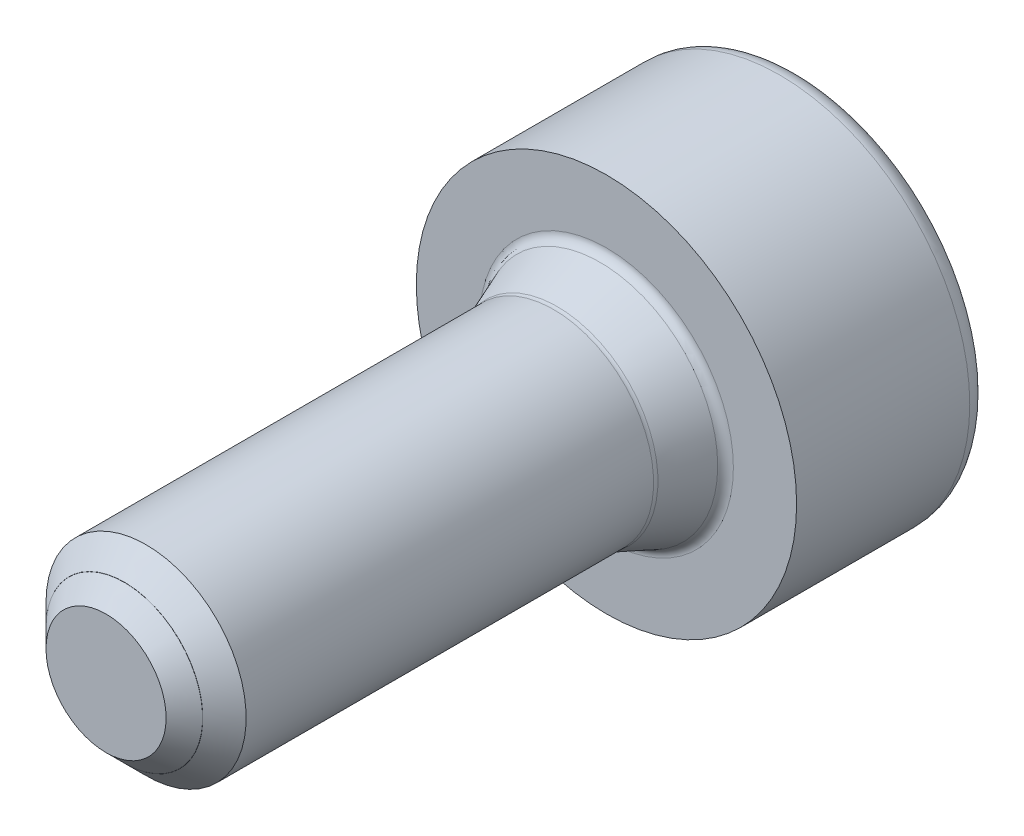
ISO-10303-21;
HEADER;
FILE_DESCRIPTION(('STEP AP214'),'2;1');
FILE_NAME('part.step','',(''),(''),'','','');
FILE_SCHEMA(('AUTOMOTIVE_DESIGN { 1 0 10303 214 1 1 1 1 }'));
ENDSEC;
DATA;
#1=APPLICATION_CONTEXT('core data for automotive mechanical design processes');
#2=APPLICATION_PROTOCOL_DEFINITION('international standard','automotive_design',2000,#1);
#3=PRODUCT_CONTEXT('',#1,'mechanical');
#4=PRODUCT('Part','Part','',(#3));
#5=PRODUCT_RELATED_PRODUCT_CATEGORY('part','',(#4));
#6=PRODUCT_DEFINITION_FORMATION('','',#4);
#7=PRODUCT_DEFINITION_CONTEXT('part definition',#1,'design');
#8=PRODUCT_DEFINITION('design','',#6,#7);
#9=PRODUCT_DEFINITION_SHAPE('','',#8);
#10=(LENGTH_UNIT() NAMED_UNIT(*) SI_UNIT(.MILLI.,.METRE.));
#11=(NAMED_UNIT(*) PLANE_ANGLE_UNIT() SI_UNIT($,.RADIAN.));
#12=(NAMED_UNIT(*) SI_UNIT($,.STERADIAN.) SOLID_ANGLE_UNIT());
#13=UNCERTAINTY_MEASURE_WITH_UNIT(LENGTH_MEASURE(1.E-05),#10,'distance_accuracy_value','');
#14=(GEOMETRIC_REPRESENTATION_CONTEXT(3) GLOBAL_UNCERTAINTY_ASSIGNED_CONTEXT((#13)) GLOBAL_UNIT_ASSIGNED_CONTEXT((#10,
#11,#12)) REPRESENTATION_CONTEXT('',''));
#15=CARTESIAN_POINT('',(0.,0.,0.));
#16=DIRECTION('',(0.,0.,1.));
#17=DIRECTION('',(1.,0.,0.));
#18=AXIS2_PLACEMENT_3D('',#15,#16,#17);
#19=CARTESIAN_POINT('',(11.,-1.35,10.82499251967));
#20=DIRECTION('',(0.,0.,-1.));
#21=DIRECTION('',(-1.,0.,0.));
#22=AXIS2_PLACEMENT_3D('',#19,#20,#21);
#23=CONICAL_SURFACE('',#22,0.4416729559301,1.04718484902488);
#24=CARTESIAN_POINT('',(11.0000000000003,-0.483974596215759,10.5799853326872));
#25=CARTESIAN_POINT('',(11.0329580428902,-0.503002931150194,10.5909748550174));
#26=CARTESIAN_POINT('',(11.0662005960396,-0.522195528159575,10.6009692526386));
#27=CARTESIAN_POINT('',(11.1332613102048,-0.560913049534868,10.6184141692237));
#28=CARTESIAN_POINT('',(11.1670806625274,-0.580438661702172,10.6258585170533));
#29=CARTESIAN_POINT('',(11.2343002358995,-0.619247900483343,10.6374461530633));
#30=CARTESIAN_POINT('',(11.2676901160255,-0.638525556762337,10.6416665775635));
#31=CARTESIAN_POINT('',(11.3346269115323,-0.677171533666861,10.6467039041215));
#32=CARTESIAN_POINT('',(11.3681735837526,-0.696539713903645,10.647524978911));
#33=CARTESIAN_POINT('',(11.4308517271364,-0.732726956858601,10.6458123276901));
#34=CARTESIAN_POINT('',(11.4599926051919,-0.749551450648388,10.6436991136606));
#35=CARTESIAN_POINT('',(11.518084506273,-0.783090825375306,10.6370028771495));
#36=CARTESIAN_POINT('',(11.5470353284991,-0.799805590380761,10.6324175693746));
#37=CARTESIAN_POINT('',(11.6052469089792,-0.833414062040914,10.6209552091911));
#38=CARTESIAN_POINT('',(11.6345003026894,-0.850303516774212,10.6140295891454));
#39=CARTESIAN_POINT('',(11.6925708787505,-0.883830579495086,10.5983113794108));
#40=CARTESIAN_POINT('',(11.7213888045643,-0.900468616721173,10.5895224807053));
#41=CARTESIAN_POINT('',(11.7500000000001,-0.916987298107893,10.5799853326871));
#42=B_SPLINE_CURVE_WITH_KNOTS('',3,(#24,#25,#26,#27,#28,#29,#30,#31,#32,#33,#34,#35,#36,#37,#38,
#39,#40,#41),.UNSPECIFIED.,.F.,.F.,(4,2,2,2,2,2,2,2,4),(0.,0.118881584152513,0.23804886286618,
0.354266945599876,0.470342327239836,0.571392045660927,0.672535338686801,0.775921626428418,
0.879104997727209),.UNSPECIFIED.);
#43=CARTESIAN_POINT('',(11.0000000000002,-0.48397459621564,10.5799853326871));
#44=VERTEX_POINT('',#43);
#45=CARTESIAN_POINT('',(11.7500000000001,-0.916987298108037,10.5799853326871));
#46=VERTEX_POINT('',#45);
#47=EDGE_CURVE('E31',#44,#46,#42,.T.);
#48=ORIENTED_EDGE('',*,*,#47,.T.);
#49=CARTESIAN_POINT('',(11.75,-0.916987298108182,10.5799853326872));
#50=CARTESIAN_POINT('',(11.75,-0.955043967977049,10.5909748550174));
#51=CARTESIAN_POINT('',(11.75,-0.993429161995811,10.6009692526386));
#52=CARTESIAN_POINT('',(11.75,-1.07086420474639,10.6184141692237));
#53=CARTESIAN_POINT('',(11.75,-1.109915429081,10.6258585170533));
#54=CARTESIAN_POINT('',(11.75,-1.18753390664334,10.6374461530633));
#55=CARTESIAN_POINT('',(11.75,-1.22608921920133,10.6416665775635));
#56=CARTESIAN_POINT('',(11.75,-1.30338117301037,10.6467039041215));
#57=CARTESIAN_POINT('',(11.75,-1.34211753348394,10.647524978911));
#58=CARTESIAN_POINT('',(11.75,-1.41449201939382,10.6458123276901));
#59=CARTESIAN_POINT('',(11.75,-1.44814100697337,10.6436991136606));
#60=CARTESIAN_POINT('',(11.75,-1.51521975642715,10.6370028771495));
#61=CARTESIAN_POINT('',(11.75,-1.54864928643803,10.6324175693746));
#62=CARTESIAN_POINT('',(11.75,-1.61586622975828,10.6209552091911));
#63=CARTESIAN_POINT('',(11.75,-1.64964513922485,10.6140295891454));
#64=CARTESIAN_POINT('',(11.75,-1.71669926466653,10.5983113794109));
#65=CARTESIAN_POINT('',(11.75,-1.74997533911868,10.5895224807053));
#66=CARTESIAN_POINT('',(11.75,-1.78301270189209,10.5799853326871));
#67=B_SPLINE_CURVE_WITH_KNOTS('',3,(#49,#50,#51,#52,#53,#54,#55,#56,#57,#58,#59,#60,#61,#62,#63,
#64,#65,#66),.UNSPECIFIED.,.F.,.F.,(4,2,2,2,2,2,2,2,4),(0.,0.118881584152513,0.238048862866177,
0.354266945599876,0.470342327239834,0.571392045660841,0.672535338686635,0.775921626428166,
0.879104997726869),.UNSPECIFIED.);
#68=CARTESIAN_POINT('',(11.75,-1.78301270189205,10.5799853326871));
#69=VERTEX_POINT('',#68);
#70=EDGE_CURVE('E10',#46,#69,#67,.T.);
#71=ORIENTED_EDGE('',*,*,#70,.T.);
#72=CARTESIAN_POINT('',(11.7499999999996,-1.78301270189211,10.5799853326873));
#73=CARTESIAN_POINT('',(11.7170419571097,-1.80204103682654,10.5909748550175));
#74=CARTESIAN_POINT('',(11.6837994039603,-1.82123363383592,10.6009692526387));
#75=CARTESIAN_POINT('',(11.6167386897952,-1.8599511552112,10.6184141692238));
#76=CARTESIAN_POINT('',(11.5829193374725,-1.8794767673785,10.6258585170534));
#77=CARTESIAN_POINT('',(11.5156997641005,-1.91828600615966,10.6374461530634));
#78=CARTESIAN_POINT('',(11.4823098839744,-1.93756366243865,10.6416665775636));
#79=CARTESIAN_POINT('',(11.4153730884677,-1.97620963934317,10.6467039041216));
#80=CARTESIAN_POINT('',(11.3818264162474,-1.99557781957995,10.6475249789111));
#81=CARTESIAN_POINT('',(11.3191482728636,-2.03176506253489,10.6458123276903));
#82=CARTESIAN_POINT('',(11.2900073948081,-2.04858955632468,10.6436991136608));
#83=CARTESIAN_POINT('',(11.231915493727,-2.08212893105159,10.6370028771496));
#84=CARTESIAN_POINT('',(11.202964671501,-2.09884369605705,10.6324175693748));
#85=CARTESIAN_POINT('',(11.1447530910209,-2.1324521677172,10.6209552091912));
#86=CARTESIAN_POINT('',(11.1154996973106,-2.14934162245049,10.6140295891456));
#87=CARTESIAN_POINT('',(11.0574291212496,-2.18286868517136,10.598311379411));
#88=CARTESIAN_POINT('',(11.0286111954358,-2.19950672239745,10.5895224807054));
#89=CARTESIAN_POINT('',(10.9999999999999,-2.21602540378417,10.5799853326873));
#90=B_SPLINE_CURVE_WITH_KNOTS('',3,(#72,#73,#74,#75,#76,#77,#78,#79,#80,#81,#82,#83,#84,#85,#86,
#87,#88,#89),.UNSPECIFIED.,.F.,.F.,(4,2,2,2,2,2,2,2,4),(0.,0.118881584152485,0.238048862866124,
0.354266945599796,0.470342327239724,0.571392045660802,0.672535338686665,0.77592162642827,
0.879104997727046),.UNSPECIFIED.);
#91=CARTESIAN_POINT('',(10.9999999999998,-2.21602540378405,10.5799853326873));
#92=VERTEX_POINT('',#91);
#93=EDGE_CURVE('E19',#69,#92,#90,.T.);
#94=ORIENTED_EDGE('',*,*,#93,.T.);
#95=CARTESIAN_POINT('',(10.9999999999997,-2.21602540378393,10.5799853326874));
#96=CARTESIAN_POINT('',(10.9670419571098,-2.1969970688495,10.5909748550176));
#97=CARTESIAN_POINT('',(10.9337994039604,-2.17780447184012,10.6009692526388));
#98=CARTESIAN_POINT('',(10.8667386897953,-2.13908695046485,10.6184141692239));
#99=CARTESIAN_POINT('',(10.8329193374726,-2.11956133829755,10.6258585170534));
#100=CARTESIAN_POINT('',(10.7656997641006,-2.08075209951639,10.6374461530635));
#101=CARTESIAN_POINT('',(10.7323098839745,-2.0614744432374,10.6416665775637));
#102=CARTESIAN_POINT('',(10.6653730884678,-2.02282846633289,10.6467039041217));
#103=CARTESIAN_POINT('',(10.6318264162475,-2.00346028609612,10.6475249789111));
#104=CARTESIAN_POINT('',(10.5691482728637,-1.96727304314116,10.6458123276903));
#105=CARTESIAN_POINT('',(10.5400073948082,-1.95044854935137,10.6436991136608));
#106=CARTESIAN_POINT('',(10.4819154937271,-1.91690917462445,10.6370028771496));
#107=CARTESIAN_POINT('',(10.452964671501,-1.90019440961899,10.6324175693747));
#108=CARTESIAN_POINT('',(10.3947530910209,-1.86658593795883,10.6209552091912));
#109=CARTESIAN_POINT('',(10.3654996973107,-1.84969648322553,10.6140295891455));
#110=CARTESIAN_POINT('',(10.3074291212496,-1.81616942050465,10.5983113794109));
#111=CARTESIAN_POINT('',(10.2786111954358,-1.79953138327856,10.5895224807054));
#112=CARTESIAN_POINT('',(10.2499999999999,-1.78301270189183,10.5799853326872));
#113=B_SPLINE_CURVE_WITH_KNOTS('',3,(#95,#96,#97,#98,#99,#100,#101,#102,#103,#104,#105,#106,
#107,#108,#109,#110,#111,#112),.UNSPECIFIED.,.F.,.F.,(4,2,2,2,2,2,2,2,4),(0.,0.11888158415247,
0.238048862866095,0.354266945599751,0.470342327239666,0.571392045660778,0.672535338686677,
0.775921626428318,0.87910499772713),.UNSPECIFIED.);
#114=CARTESIAN_POINT('',(10.25,-1.78301270189172,10.5799853326872));
#115=VERTEX_POINT('',#114);
#116=EDGE_CURVE('E72',#92,#115,#113,.T.);
#117=ORIENTED_EDGE('',*,*,#116,.T.);
#118=CARTESIAN_POINT('',(10.25,-1.78301270189161,10.5799853326873));
#119=CARTESIAN_POINT('',(10.25,-1.74495603202275,10.5909748550174));
#120=CARTESIAN_POINT('',(10.25,-1.70657083800399,10.6009692526387));
#121=CARTESIAN_POINT('',(10.25,-1.62913579525342,10.6184141692237));
#122=CARTESIAN_POINT('',(10.25,-1.59008457091881,10.6258585170533));
#123=CARTESIAN_POINT('',(10.25,-1.51246609335648,10.6374461530633));
#124=CARTESIAN_POINT('',(10.25,-1.4739107807985,10.6416665775635));
#125=CARTESIAN_POINT('',(10.25,-1.39661882698946,10.6467039041215));
#126=CARTESIAN_POINT('',(10.25,-1.3578824665159,10.647524978911));
#127=CARTESIAN_POINT('',(10.25,-1.28550798060601,10.6458123276901));
#128=CARTESIAN_POINT('',(10.25,-1.25185899302646,10.6436991136606));
#129=CARTESIAN_POINT('',(10.25,-1.18478024357266,10.6370028771494));
#130=CARTESIAN_POINT('',(10.25,-1.15135071356177,10.6324175693746));
#131=CARTESIAN_POINT('',(10.25,-1.08413377024151,10.620955209191));
#132=CARTESIAN_POINT('',(10.25,-1.05035486077493,10.6140295891454));
#133=CARTESIAN_POINT('',(10.25,-0.983300735333227,10.5983113794108));
#134=CARTESIAN_POINT('',(10.25,-0.950024660881073,10.5895224807052));
#135=CARTESIAN_POINT('',(10.25,-0.916987298107654,10.5799853326871));
#136=B_SPLINE_CURVE_WITH_KNOTS('',3,(#118,#119,#120,#121,#122,#123,#124,#125,#126,#127,#128,
#129,#130,#131,#132,#133,#134,#135),.UNSPECIFIED.,.F.,.F.,(4,2,2,2,2,2,2,2,4),(0.,
0.118881584152499,0.238048862866149,0.354266945599835,0.470342327239778,0.571392045660812,
0.672535338686631,0.775921626428189,0.879104997726918),.UNSPECIFIED.);
#137=CARTESIAN_POINT('',(10.2500000000002,-0.916987298107647,10.5799853326871));
#138=VERTEX_POINT('',#137);
#139=EDGE_CURVE('E154',#115,#138,#136,.T.);
#140=ORIENTED_EDGE('',*,*,#139,.T.);
#141=CARTESIAN_POINT('',(10.2500000000003,-0.916987298107641,10.5799853326872));
#142=CARTESIAN_POINT('',(10.2829580428902,-0.897958963173206,10.5909748550174));
#143=CARTESIAN_POINT('',(10.3162005960396,-0.878766366163824,10.6009692526386));
#144=CARTESIAN_POINT('',(10.3832613102048,-0.840048844788532,10.6184141692237));
#145=CARTESIAN_POINT('',(10.4170806625274,-0.820523232621228,10.6258585170533));
#146=CARTESIAN_POINT('',(10.4843002358995,-0.781713993840057,10.6374461530633));
#147=CARTESIAN_POINT('',(10.5176901160255,-0.762436337561063,10.6416665775635));
#148=CARTESIAN_POINT('',(10.5846269115323,-0.72379036065654,10.6467039041215));
#149=CARTESIAN_POINT('',(10.6181735837526,-0.704422180419756,10.647524978911));
#150=CARTESIAN_POINT('',(10.6808517271364,-0.668234937464802,10.6458123276901));
#151=CARTESIAN_POINT('',(10.7099926051919,-0.651410443675015,10.6436991136606));
#152=CARTESIAN_POINT('',(10.768084506273,-0.617871068948099,10.6370028771495));
#153=CARTESIAN_POINT('',(10.797035328499,-0.601156303942644,10.6324175693746));
#154=CARTESIAN_POINT('',(10.8552469089792,-0.567547832282494,10.6209552091911));
#155=CARTESIAN_POINT('',(10.8845003026894,-0.550658377549196,10.6140295891454));
#156=CARTESIAN_POINT('',(10.9425708787505,-0.517131314828325,10.5983113794108));
#157=CARTESIAN_POINT('',(10.9713888045643,-0.500493277602238,10.5895224807053));
#158=CARTESIAN_POINT('',(11.0000000000001,-0.48397459621552,10.5799853326871));
#159=B_SPLINE_CURVE_WITH_KNOTS('',3,(#141,#142,#143,#144,#145,#146,#147,#148,#149,#150,#151,
#152,#153,#154,#155,#156,#157,#158),.UNSPECIFIED.,.F.,.F.,(4,2,2,2,2,2,2,2,4),(0.,
0.118881584152513,0.238048862866178,0.354266945599874,0.470342327239834,0.571392045660917,
0.672535338686789,0.775921626428399,0.879104997727181),.UNSPECIFIED.);
#160=EDGE_CURVE('E126',#138,#44,#159,.T.);
#161=ORIENTED_EDGE('',*,*,#160,.T.);
#162=EDGE_LOOP('',(#48,#71,#94,#117,#140,#161));
#163=FACE_BOUND('',#162,.T.);
#164=CARTESIAN_POINT('',(11.,-1.35,11.08));
#165=VERTEX_POINT('',#164);
#166=VERTEX_LOOP('',#165);
#167=FACE_BOUND('',#166,.T.);
#168=ADVANCED_FACE('F15',(#163,#167),#23,.F.);
#169=CARTESIAN_POINT('',(11.75,-1.35,10.33));
#170=DIRECTION('',(1.,0.,0.));
#171=DIRECTION('',(0.,1.,0.));
#172=AXIS2_PLACEMENT_3D('',#169,#170,#171);
#173=PLANE('',#172);
#174=DIRECTION('',(0.,-1.,0.));
#175=VECTOR('',#174,1.);
#176=CARTESIAN_POINT('',(11.75,-0.9169872981078,9.58));
#177=LINE('',#176,#175);
#178=CARTESIAN_POINT('',(11.75,-0.9169872981078,9.58));
#179=VERTEX_POINT('',#178);
#180=CARTESIAN_POINT('',(11.75,-1.783012701892,9.58));
#181=VERTEX_POINT('',#180);
#182=EDGE_CURVE('E329',#179,#181,#177,.T.);
#183=ORIENTED_EDGE('',*,*,#182,.T.);
#184=DIRECTION('',(0.,0.,-1.));
#185=VECTOR('',#184,1.);
#186=CARTESIAN_POINT('',(11.75,-1.783012701892,10.57998533269));
#187=LINE('',#186,#185);
#188=EDGE_CURVE('E149',#69,#181,#187,.T.);
#189=ORIENTED_EDGE('',*,*,#188,.F.);
#190=ORIENTED_EDGE('',*,*,#70,.F.);
#191=DIRECTION('',(0.,0.,-1.));
#192=VECTOR('',#191,1.);
#193=CARTESIAN_POINT('',(11.75,-0.9169872981078,10.57998533269));
#194=LINE('',#193,#192);
#195=EDGE_CURVE('E130',#46,#179,#194,.T.);
#196=ORIENTED_EDGE('',*,*,#195,.T.);
#197=EDGE_LOOP('',(#183,#189,#190,#196));
#198=FACE_BOUND('',#197,.T.);
#199=ADVANCED_FACE('F117',(#198),#173,.F.);
#200=CARTESIAN_POINT('',(11.375,-0.7004809471617,10.33));
#201=DIRECTION('',(0.500000000000017,0.866025403784429,0.));
#202=DIRECTION('',(0.,0.,-1.));
#203=AXIS2_PLACEMENT_3D('',#200,#201,#202);
#204=PLANE('',#203);
#205=DIRECTION('',(-0.866025403784429,0.500000000000017,0.));
#206=VECTOR('',#205,1.);
#207=CARTESIAN_POINT('',(11.75,-0.9169872981078,9.58));
#208=LINE('',#207,#206);
#209=CARTESIAN_POINT('',(11.,-0.4839745962156,9.58));
#210=VERTEX_POINT('',#209);
#211=EDGE_CURVE('E134',#179,#210,#208,.T.);
#212=ORIENTED_EDGE('',*,*,#211,.F.);
#213=ORIENTED_EDGE('',*,*,#195,.F.);
#214=ORIENTED_EDGE('',*,*,#47,.F.);
#215=DIRECTION('',(0.,0.,-1.));
#216=VECTOR('',#215,1.);
#217=CARTESIAN_POINT('',(11.,-0.4839745962156,10.57998533269));
#218=LINE('',#217,#216);
#219=EDGE_CURVE('E143',#44,#210,#218,.T.);
#220=ORIENTED_EDGE('',*,*,#219,.T.);
#221=EDGE_LOOP('',(#212,#213,#214,#220));
#222=FACE_BOUND('',#221,.T.);
#223=ADVANCED_FACE('F122',(#222),#204,.F.);
#224=CARTESIAN_POINT('',(10.625,-0.7004809471617,10.33));
#225=DIRECTION('',(-0.500000000000017,0.866025403784429,0.));
#226=DIRECTION('',(0.,0.,1.));
#227=AXIS2_PLACEMENT_3D('',#224,#225,#226);
#228=PLANE('',#227);
#229=DIRECTION('',(-0.866025403784429,-0.500000000000017,0.));
#230=VECTOR('',#229,1.);
#231=CARTESIAN_POINT('',(11.,-0.4839745962156,9.58));
#232=LINE('',#231,#230);
#233=CARTESIAN_POINT('',(10.25,-0.9169872981078,9.58));
#234=VERTEX_POINT('',#233);
#235=EDGE_CURVE('E290',#210,#234,#232,.T.);
#236=ORIENTED_EDGE('',*,*,#235,.F.);
#237=ORIENTED_EDGE('',*,*,#219,.F.);
#238=ORIENTED_EDGE('',*,*,#160,.F.);
#239=DIRECTION('',(0.,0.,-1.));
#240=VECTOR('',#239,1.);
#241=CARTESIAN_POINT('',(10.25,-0.9169872981078,10.57998533269));
#242=LINE('',#241,#240);
#243=EDGE_CURVE('E155',#138,#234,#242,.T.);
#244=ORIENTED_EDGE('',*,*,#243,.T.);
#245=EDGE_LOOP('',(#236,#237,#238,#244));
#246=FACE_BOUND('',#245,.T.);
#247=ADVANCED_FACE('F239',(#246),#228,.F.);
#248=CARTESIAN_POINT('',(10.25,-1.35,10.33));
#249=DIRECTION('',(-1.,0.,0.));
#250=DIRECTION('',(0.,0.,1.));
#251=AXIS2_PLACEMENT_3D('',#248,#249,#250);
#252=PLANE('',#251);
#253=DIRECTION('',(0.,1.,0.));
#254=VECTOR('',#253,1.);
#255=CARTESIAN_POINT('',(10.25,-1.783012701892,9.58));
#256=LINE('',#255,#254);
#257=CARTESIAN_POINT('',(10.25,-1.783012701892,9.58));
#258=VERTEX_POINT('',#257);
#259=EDGE_CURVE('E287',#258,#234,#256,.T.);
#260=ORIENTED_EDGE('',*,*,#259,.T.);
#261=ORIENTED_EDGE('',*,*,#243,.F.);
#262=ORIENTED_EDGE('',*,*,#139,.F.);
#263=DIRECTION('',(0.,0.,-1.));
#264=VECTOR('',#263,1.);
#265=CARTESIAN_POINT('',(10.25,-1.783012701892,10.57998533269));
#266=LINE('',#265,#264);
#267=EDGE_CURVE('E80',#115,#258,#266,.T.);
#268=ORIENTED_EDGE('',*,*,#267,.T.);
#269=EDGE_LOOP('',(#260,#261,#262,#268));
#270=FACE_BOUND('',#269,.T.);
#271=ADVANCED_FACE('F258',(#270),#252,.F.);
#272=CARTESIAN_POINT('',(10.625,-1.999519052838,10.33));
#273=DIRECTION('',(-0.500000000000017,-0.866025403784429,0.));
#274=DIRECTION('',(-0.866025403784429,0.500000000000017,0.));
#275=AXIS2_PLACEMENT_3D('',#272,#273,#274);
#276=PLANE('',#275);
#277=DIRECTION('',(0.866025403784429,-0.500000000000017,0.));
#278=VECTOR('',#277,1.);
#279=CARTESIAN_POINT('',(10.25,-1.783012701892,9.58));
#280=LINE('',#279,#278);
#281=CARTESIAN_POINT('',(11.,-2.216025403784,9.58));
#282=VERTEX_POINT('',#281);
#283=EDGE_CURVE('E147',#258,#282,#280,.T.);
#284=ORIENTED_EDGE('',*,*,#283,.F.);
#285=ORIENTED_EDGE('',*,*,#267,.F.);
#286=ORIENTED_EDGE('',*,*,#116,.F.);
#287=DIRECTION('',(0.,0.,-1.));
#288=VECTOR('',#287,1.);
#289=CARTESIAN_POINT('',(11.,-2.216025403784,10.57998533269));
#290=LINE('',#289,#288);
#291=EDGE_CURVE('E160',#92,#282,#290,.T.);
#292=ORIENTED_EDGE('',*,*,#291,.T.);
#293=EDGE_LOOP('',(#284,#285,#286,#292));
#294=FACE_BOUND('',#293,.T.);
#295=ADVANCED_FACE('F264',(#294),#276,.F.);
#296=CARTESIAN_POINT('',(11.375,-1.999519052838,10.33));
#297=DIRECTION('',(0.500000000000017,-0.866025403784429,0.));
#298=DIRECTION('',(0.,0.,-1.));
#299=AXIS2_PLACEMENT_3D('',#296,#297,#298);
#300=PLANE('',#299);
#301=DIRECTION('',(0.866025403784429,0.500000000000017,0.));
#302=VECTOR('',#301,1.);
#303=CARTESIAN_POINT('',(11.,-2.216025403784,9.58));
#304=LINE('',#303,#302);
#305=EDGE_CURVE('E325',#282,#181,#304,.T.);
#306=ORIENTED_EDGE('',*,*,#305,.F.);
#307=ORIENTED_EDGE('',*,*,#291,.F.);
#308=ORIENTED_EDGE('',*,*,#93,.F.);
#309=ORIENTED_EDGE('',*,*,#188,.T.);
#310=EDGE_LOOP('',(#306,#307,#308,#309));
#311=FACE_BOUND('',#310,.T.);
#312=ADVANCED_FACE('F268',(#311),#300,.F.);
#313=CARTESIAN_POINT('',(11.,-1.35,9.58));
#314=DIRECTION('',(0.,0.,-1.));
#315=DIRECTION('',(0.,-1.,0.));
#316=AXIS2_PLACEMENT_3D('',#313,#314,#315);
#317=PLANE('',#316);
#318=CARTESIAN_POINT('',(11.,-1.35,9.58));
#319=DIRECTION('',(0.,0.,-1.));
#320=DIRECTION('',(1.,0.,0.));
#321=AXIS2_PLACEMENT_3D('',#318,#319,#320);
#322=CIRCLE('',#321,1.7);
#323=CARTESIAN_POINT('',(12.7,-1.35,9.58));
#324=VERTEX_POINT('',#323);
#325=EDGE_CURVE('E321',#324,#324,#322,.T.);
#326=ORIENTED_EDGE('',*,*,#325,.T.);
#327=EDGE_LOOP('',(#326));
#328=FACE_BOUND('',#327,.T.);
#329=ORIENTED_EDGE('',*,*,#305,.T.);
#330=ORIENTED_EDGE('',*,*,#182,.F.);
#331=ORIENTED_EDGE('',*,*,#211,.T.);
#332=ORIENTED_EDGE('',*,*,#235,.T.);
#333=ORIENTED_EDGE('',*,*,#259,.F.);
#334=ORIENTED_EDGE('',*,*,#283,.T.);
#335=EDGE_LOOP('',(#329,#330,#331,#332,#333,#334));
#336=FACE_BOUND('',#335,.T.);
#337=ADVANCED_FACE('F269',(#328,#336),#317,.T.);
#338=CARTESIAN_POINT('',(11.,-1.35,9.78));
#339=DIRECTION('',(0.,0.,-1.));
#340=DIRECTION('',(-1.,0.,0.));
#341=AXIS2_PLACEMENT_3D('',#338,#339,#340);
#342=TOROIDAL_SURFACE('',#341,1.7,0.2);
#343=ORIENTED_EDGE('',*,*,#325,.F.);
#344=EDGE_LOOP('',(#343));
#345=FACE_BOUND('',#344,.T.);
#346=CARTESIAN_POINT('',(11.,-1.35,9.78));
#347=DIRECTION('',(0.,0.,-1.));
#348=DIRECTION('',(-1.,0.,0.));
#349=AXIS2_PLACEMENT_3D('',#346,#347,#348);
#350=CIRCLE('',#349,1.9);
#351=CARTESIAN_POINT('',(9.1,-1.35,9.78));
#352=VERTEX_POINT('',#351);
#353=EDGE_CURVE('E326',#352,#352,#350,.T.);
#354=ORIENTED_EDGE('',*,*,#353,.T.);
#355=EDGE_LOOP('',(#354));
#356=FACE_BOUND('',#355,.T.);
#357=ADVANCED_FACE('F181',(#345,#356),#342,.T.);
#358=CARTESIAN_POINT('',(11.,-1.35,9.58));
#359=DIRECTION('',(0.,0.,1.));
#360=DIRECTION('',(1.,0.,0.));
#361=AXIS2_PLACEMENT_3D('',#358,#359,#360);
#362=CYLINDRICAL_SURFACE('',#361,1.9);
#363=CARTESIAN_POINT('',(11.,-1.35,11.51));
#364=DIRECTION('',(0.,0.,1.));
#365=DIRECTION('',(1.,0.,0.));
#366=AXIS2_PLACEMENT_3D('',#363,#364,#365);
#367=CIRCLE('',#366,1.9);
#368=CARTESIAN_POINT('',(12.9,-1.35,11.51));
#369=VERTEX_POINT('',#368);
#370=EDGE_CURVE('E298',#369,#369,#367,.T.);
#371=ORIENTED_EDGE('',*,*,#370,.F.);
#372=EDGE_LOOP('',(#371));
#373=FACE_BOUND('',#372,.T.);
#374=ORIENTED_EDGE('',*,*,#353,.F.);
#375=EDGE_LOOP('',(#374));
#376=FACE_BOUND('',#375,.T.);
#377=ADVANCED_FACE('F396',(#373,#376),#362,.T.);
#378=CARTESIAN_POINT('',(11.,-1.35,11.51));
#379=DIRECTION('',(0.,0.,1.));
#380=DIRECTION('',(1.,0.,0.));
#381=AXIS2_PLACEMENT_3D('',#378,#379,#380);
#382=PLANE('',#381);
#383=ORIENTED_EDGE('',*,*,#370,.T.);
#384=EDGE_LOOP('',(#383));
#385=FACE_BOUND('',#384,.T.);
#386=CARTESIAN_POINT('',(11.,-1.35,11.51));
#387=DIRECTION('',(0.,0.,-1.));
#388=DIRECTION('',(-1.,0.,0.));
#389=AXIS2_PLACEMENT_3D('',#386,#387,#388);
#390=CIRCLE('',#389,1.268198791567);
#391=CARTESIAN_POINT('',(9.731801208433,-1.35,11.51));
#392=VERTEX_POINT('',#391);
#393=EDGE_CURVE('E300',#392,#392,#390,.T.);
#394=ORIENTED_EDGE('',*,*,#393,.T.);
#395=EDGE_LOOP('',(#394));
#396=FACE_BOUND('',#395,.T.);
#397=ADVANCED_FACE('F465',(#385,#396),#382,.T.);
#398=CARTESIAN_POINT('',(11.,-1.35,11.61));
#399=DIRECTION('',(0.,0.,1.));
#400=DIRECTION('',(1.,0.,0.));
#401=AXIS2_PLACEMENT_3D('',#398,#399,#400);
#402=TOROIDAL_SURFACE('',#401,1.268198791567,0.1);
#403=ORIENTED_EDGE('',*,*,#393,.F.);
#404=EDGE_LOOP('',(#403));
#405=FACE_BOUND('',#404,.T.);
#406=CARTESIAN_POINT('',(11.,-1.35,11.57349124712));
#407=DIRECTION('',(0.,0.,-1.));
#408=DIRECTION('',(1.,0.,0.));
#409=AXIS2_PLACEMENT_3D('',#406,#407,#408);
#410=CIRCLE('',#409,1.175101471718);
#411=CARTESIAN_POINT('',(12.175101471718,-1.35,11.57349124712));
#412=VERTEX_POINT('',#411);
#413=EDGE_CURVE('E304',#412,#412,#410,.T.);
#414=ORIENTED_EDGE('',*,*,#413,.T.);
#415=EDGE_LOOP('',(#414));
#416=FACE_BOUND('',#415,.T.);
#417=ADVANCED_FACE('F230',(#405,#416),#402,.F.);
#418=CARTESIAN_POINT('',(11.,-1.35,11.78794470637));
#419=DIRECTION('',(0.,0.,-1.));
#420=DIRECTION('',(-1.,0.,0.));
#421=AXIS2_PLACEMENT_3D('',#418,#419,#420);
#422=CONICAL_SURFACE('',#421,1.091002075935,0.373726819965523);
#423=ORIENTED_EDGE('',*,*,#413,.F.);
#424=EDGE_LOOP('',(#423));
#425=FACE_BOUND('',#424,.T.);
#426=CARTESIAN_POINT('',(11.,-1.35,12.00239816561));
#427=DIRECTION('',(0.,0.,1.));
#428=DIRECTION('',(-1.,0.,0.));
#429=AXIS2_PLACEMENT_3D('',#426,#427,#428);
#430=CIRCLE('',#429,1.006902680151);
#431=CARTESIAN_POINT('',(9.993097319849,-1.35,12.00239816561));
#432=VERTEX_POINT('',#431);
#433=EDGE_CURVE('E314',#432,#432,#430,.T.);
#434=ORIENTED_EDGE('',*,*,#433,.F.);
#435=EDGE_LOOP('',(#434));
#436=FACE_BOUND('',#435,.T.);
#437=ADVANCED_FACE('F226',(#425,#436),#422,.T.);
#438=CARTESIAN_POINT('',(11.,-1.35,12.0389069185));
#439=DIRECTION('',(0.,0.,-1.));
#440=DIRECTION('',(-1.,0.,0.));
#441=AXIS2_PLACEMENT_3D('',#438,#439,#440);
#442=TOROIDAL_SURFACE('',#441,1.1,0.1);
#443=CARTESIAN_POINT('',(11.,-1.35,12.0389069185));
#444=DIRECTION('',(0.,0.,-1.));
#445=DIRECTION('',(-1.,0.,0.));
#446=AXIS2_PLACEMENT_3D('',#443,#444,#445);
#447=CIRCLE('',#446,1.);
#448=CARTESIAN_POINT('',(10.,-1.35,12.0389069185));
#449=VERTEX_POINT('',#448);
#450=EDGE_CURVE('E309',#449,#449,#447,.T.);
#451=ORIENTED_EDGE('',*,*,#450,.T.);
#452=EDGE_LOOP('',(#451));
#453=FACE_BOUND('',#452,.T.);
#454=ORIENTED_EDGE('',*,*,#433,.T.);
#455=EDGE_LOOP('',(#454));
#456=FACE_BOUND('',#455,.T.);
#457=ADVANCED_FACE('F229',(#453,#456),#442,.F.);
#458=CARTESIAN_POINT('',(11.,-1.35,11.51));
#459=DIRECTION('',(0.,0.,1.));
#460=DIRECTION('',(1.,0.,0.));
#461=AXIS2_PLACEMENT_3D('',#458,#459,#460);
#462=CYLINDRICAL_SURFACE('',#461,1.);
#463=CARTESIAN_POINT('',(11.,-1.35,16.11));
#464=DIRECTION('',(0.,0.,1.));
#465=DIRECTION('',(-1.,0.,0.));
#466=AXIS2_PLACEMENT_3D('',#463,#464,#465);
#467=CIRCLE('',#466,1.);
#468=CARTESIAN_POINT('',(10.,-1.35,16.11));
#469=VERTEX_POINT('',#468);
#470=EDGE_CURVE('E305',#469,#469,#467,.T.);
#471=ORIENTED_EDGE('',*,*,#470,.F.);
#472=EDGE_LOOP('',(#471));
#473=FACE_BOUND('',#472,.T.);
#474=ORIENTED_EDGE('',*,*,#450,.F.);
#475=EDGE_LOOP('',(#474));
#476=FACE_BOUND('',#475,.T.);
#477=ADVANCED_FACE('F234',(#473,#476),#462,.T.);
#478=CARTESIAN_POINT('',(11.,-1.35,16.2182531754));
#479=DIRECTION('',(0.,0.,-1.));
#480=DIRECTION('',(-1.,0.,0.));
#481=AXIS2_PLACEMENT_3D('',#478,#479,#480);
#482=CONICAL_SURFACE('',#481,0.8917468246,0.785398163397448);
#483=ORIENTED_EDGE('',*,*,#470,.T.);
#484=EDGE_LOOP('',(#483));
#485=FACE_BOUND('',#484,.T.);
#486=CARTESIAN_POINT('',(11.,-1.35,16.3265063508));
#487=DIRECTION('',(0.,0.,-1.));
#488=DIRECTION('',(-1.,0.,0.));
#489=AXIS2_PLACEMENT_3D('',#486,#487,#488);
#490=CIRCLE('',#489,0.7834936492);
#491=CARTESIAN_POINT('',(10.2165063508,-1.35,16.3265063508));
#492=VERTEX_POINT('',#491);
#493=EDGE_CURVE('E310',#492,#492,#490,.T.);
#494=ORIENTED_EDGE('',*,*,#493,.T.);
#495=EDGE_LOOP('',(#494));
#496=FACE_BOUND('',#495,.T.);
#497=ADVANCED_FACE('F224',(#485,#496),#482,.T.);
#498=CARTESIAN_POINT('',(11.,-1.35,12.71));
#499=DIRECTION('',(0.,0.,1.));
#500=DIRECTION('',(1.,0.,0.));
#501=AXIS2_PLACEMENT_3D('',#498,#499,#500);
#502=CYLINDRICAL_SURFACE('',#501,0.7834936492);
#503=ORIENTED_EDGE('',*,*,#493,.F.);
#504=EDGE_LOOP('',(#503));
#505=FACE_BOUND('',#504,.T.);
#506=CARTESIAN_POINT('',(11.,-1.35,12.7100000000021));
#507=DIRECTION('',(0.,0.,1.));
#508=DIRECTION('',(-1.,0.,0.));
#509=AXIS2_PLACEMENT_3D('',#506,#507,#508);
#510=CIRCLE('',#509,0.7834936492);
#511=CARTESIAN_POINT('',(10.2165063508,-1.35,12.7100000000021));
#512=VERTEX_POINT('',#511);
#513=EDGE_CURVE('E594',#512,#512,#510,.T.);
#514=ORIENTED_EDGE('',*,*,#513,.F.);
#515=EDGE_LOOP('',(#514));
#516=FACE_BOUND('',#515,.T.);
#517=ADVANCED_FACE('F213',(#505,#516),#502,.F.);
#518=CARTESIAN_POINT('',(11.,-1.35,12.31006534829));
#519=DIRECTION('',(0.,0.,-1.));
#520=DIRECTION('',(-1.,0.,0.));
#521=AXIS2_PLACEMENT_3D('',#518,#519,#520);
#522=CONICAL_SURFACE('',#521,0.8912292208862,0.263136610985763);
#523=CARTESIAN_POINT('',(11.,-1.35,11.9099772854401));
#524=DIRECTION('',(0.,0.,1.));
#525=DIRECTION('',(1.,0.,0.));
#526=AXIS2_PLACEMENT_3D('',#523,#524,#525);
#527=CIRCLE('',#526,0.998006118914605);
#528=CARTESIAN_POINT('',(11.9985061191075,-1.35,11.909977284725));
#529=VERTEX_POINT('',#528);
#530=CARTESIAN_POINT('',(10.0014938808925,-1.35,11.909977284725));
#531=VERTEX_POINT('',#530);
#532=EDGE_CURVE('E110',#529,#531,#527,.T.);
#533=ORIENTED_EDGE('',*,*,#532,.F.);
#534=CARTESIAN_POINT('',(11.,-1.35,11.90997728401));
#535=DIRECTION('',(0.,0.,1.));
#536=DIRECTION('',(-1.,0.,0.));
#537=AXIS2_PLACEMENT_3D('',#534,#535,#536);
#538=CIRCLE('',#537,0.998006119299849);
#539=EDGE_CURVE('E196',#531,#529,#538,.T.);
#540=ORIENTED_EDGE('',*,*,#539,.F.);
#541=EDGE_LOOP('',(#533,#540));
#542=FACE_BOUND('',#541,.T.);
#543=ORIENTED_EDGE('',*,*,#513,.T.);
#544=EDGE_LOOP('',(#543));
#545=FACE_BOUND('',#544,.T.);
#546=ADVANCED_FACE('F179',(#542,#545),#522,.F.);
#547=CARTESIAN_POINT('',(11.,-1.35,12.3099397697));
#548=DIRECTION('',(0.,0.,-1.));
#549=DIRECTION('',(-1.,0.,0.));
#550=AXIS2_PLACEMENT_3D('',#547,#548,#549);
#551=CONICAL_SURFACE('',#550,0.8902630496149,0.263136610985763);
#552=ORIENTED_EDGE('',*,*,#539,.T.);
#553=ORIENTED_EDGE('',*,*,#532,.T.);
#554=EDGE_LOOP('',(#552,#553));
#555=FACE_BOUND('',#554,.T.);
#556=CARTESIAN_POINT('',(11.,-1.35,12.7099999999988));
#557=DIRECTION('',(0.,0.,-1.));
#558=DIRECTION('',(-1.,0.,0.));
#559=AXIS2_PLACEMENT_3D('',#556,#557,#558);
#560=CIRCLE('',#559,0.7824936492);
#561=CARTESIAN_POINT('',(10.2175063508,-1.35,12.7099999999988));
#562=VERTEX_POINT('',#561);
#563=EDGE_CURVE('E592',#562,#562,#560,.T.);
#564=ORIENTED_EDGE('',*,*,#563,.T.);
#565=EDGE_LOOP('',(#564));
#566=FACE_BOUND('',#565,.T.);
#567=ADVANCED_FACE('F168',(#555,#566),#551,.T.);
#568=CARTESIAN_POINT('',(11.,-1.35,12.71));
#569=DIRECTION('',(0.,0.,1.));
#570=DIRECTION('',(1.,0.,0.));
#571=AXIS2_PLACEMENT_3D('',#568,#569,#570);
#572=CYLINDRICAL_SURFACE('',#571,0.7824936492);
#573=CARTESIAN_POINT('',(11.,-1.35,16.3275063508));
#574=DIRECTION('',(0.,0.,1.));
#575=DIRECTION('',(-1.,0.,0.));
#576=AXIS2_PLACEMENT_3D('',#573,#574,#575);
#577=CIRCLE('',#576,0.7824936492);
#578=CARTESIAN_POINT('',(10.2175063508,-1.35,16.3275063508));
#579=VERTEX_POINT('',#578);
#580=EDGE_CURVE('E627',#579,#579,#577,.T.);
#581=ORIENTED_EDGE('',*,*,#580,.F.);
#582=EDGE_LOOP('',(#581));
#583=FACE_BOUND('',#582,.T.);
#584=ORIENTED_EDGE('',*,*,#563,.F.);
#585=EDGE_LOOP('',(#584));
#586=FACE_BOUND('',#585,.T.);
#587=ADVANCED_FACE('F178',(#583,#586),#572,.T.);
#588=CARTESIAN_POINT('',(11.,-1.35,16.2182531754));
#589=DIRECTION('',(0.,0.,-1.));
#590=DIRECTION('',(-1.,0.,0.));
#591=AXIS2_PLACEMENT_3D('',#588,#589,#590);
#592=CONICAL_SURFACE('',#591,0.8917468246,0.785398163397448);
#593=ORIENTED_EDGE('',*,*,#580,.T.);
#594=EDGE_LOOP('',(#593));
#595=FACE_BOUND('',#594,.T.);
#596=CARTESIAN_POINT('',(11.,-1.35,16.51));
#597=DIRECTION('',(0.,0.,1.));
#598=DIRECTION('',(1.,0.,0.));
#599=AXIS2_PLACEMENT_3D('',#596,#597,#598);
#600=CIRCLE('',#599,0.6);
#601=CARTESIAN_POINT('',(11.6,-1.35,16.51));
#602=VERTEX_POINT('',#601);
#603=EDGE_CURVE('E632',#602,#602,#600,.T.);
#604=ORIENTED_EDGE('',*,*,#603,.F.);
#605=EDGE_LOOP('',(#604));
#606=FACE_BOUND('',#605,.T.);
#607=ADVANCED_FACE('F380',(#595,#606),#592,.T.);
#608=CARTESIAN_POINT('',(11.,-1.35,16.51));
#609=DIRECTION('',(0.,0.,1.));
#610=DIRECTION('',(1.,0.,0.));
#611=AXIS2_PLACEMENT_3D('',#608,#609,#610);
#612=PLANE('',#611);
#613=ORIENTED_EDGE('',*,*,#603,.T.);
#614=EDGE_LOOP('',(#613));
#615=FACE_BOUND('',#614,.T.);
#616=ADVANCED_FACE('F180',(#615),#612,.T.);
#617=CLOSED_SHELL('',(#168,#199,#223,#247,#271,#295,#312,#337,#357,#377,#397,#417,#437,#457,
#477,#497,#517,#546,#567,#587,#607,#616));
#618=MANIFOLD_SOLID_BREP('B1',#617);
#619=ADVANCED_BREP_SHAPE_REPRESENTATION('',(#18,#618),#14);
#620=SHAPE_DEFINITION_REPRESENTATION(#9,#619);
ENDSEC;
END-ISO-10303-21;
